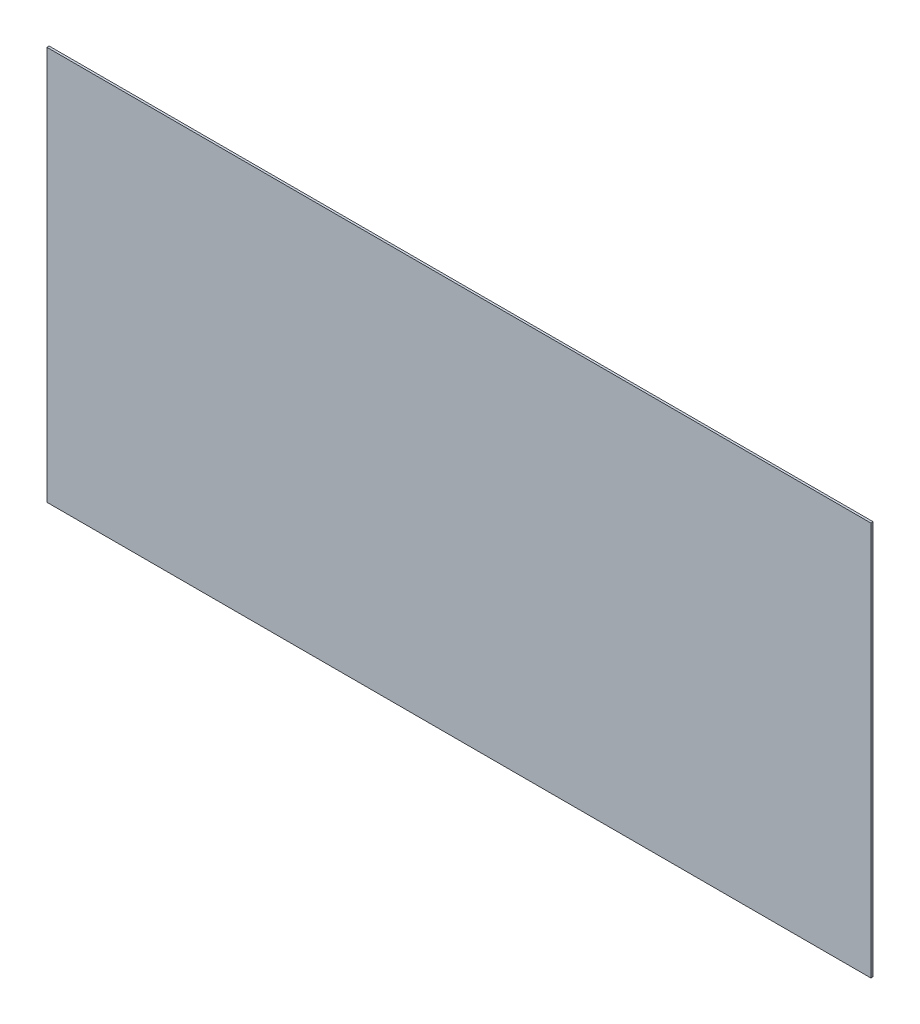
ISO-10303-21;
HEADER;
FILE_DESCRIPTION(('STEP AP214'),'2;1');
FILE_NAME('part.step','',(''),(''),'','','');
FILE_SCHEMA(('AUTOMOTIVE_DESIGN { 1 0 10303 214 1 1 1 1 }'));
ENDSEC;
DATA;
#1=APPLICATION_CONTEXT('core data for automotive mechanical design processes');
#2=APPLICATION_PROTOCOL_DEFINITION('international standard','automotive_design',2000,#1);
#3=PRODUCT_CONTEXT('',#1,'mechanical');
#4=PRODUCT('Part','Part','',(#3));
#5=PRODUCT_RELATED_PRODUCT_CATEGORY('part','',(#4));
#6=PRODUCT_DEFINITION_FORMATION('','',#4);
#7=PRODUCT_DEFINITION_CONTEXT('part definition',#1,'design');
#8=PRODUCT_DEFINITION('design','',#6,#7);
#9=PRODUCT_DEFINITION_SHAPE('','',#8);
#10=(LENGTH_UNIT() NAMED_UNIT(*) SI_UNIT(.MILLI.,.METRE.));
#11=(NAMED_UNIT(*) PLANE_ANGLE_UNIT() SI_UNIT($,.RADIAN.));
#12=(NAMED_UNIT(*) SI_UNIT($,.STERADIAN.) SOLID_ANGLE_UNIT());
#13=UNCERTAINTY_MEASURE_WITH_UNIT(LENGTH_MEASURE(1.E-05),#10,'distance_accuracy_value','');
#14=(GEOMETRIC_REPRESENTATION_CONTEXT(3) GLOBAL_UNCERTAINTY_ASSIGNED_CONTEXT((#13)) GLOBAL_UNIT_ASSIGNED_CONTEXT((#10,
#11,#12)) REPRESENTATION_CONTEXT('',''));
#15=CARTESIAN_POINT('',(0.,0.,0.));
#16=DIRECTION('',(0.,0.,1.));
#17=DIRECTION('',(1.,0.,0.));
#18=AXIS2_PLACEMENT_3D('',#15,#16,#17);
#19=CARTESIAN_POINT('',(0.,0.,1.5875));
#20=DIRECTION('',(1.,0.,0.));
#21=DIRECTION('',(0.,1.,0.));
#22=AXIS2_PLACEMENT_3D('',#19,#20,#21);
#23=PLANE('',#22);
#24=DIRECTION('',(0.,-1.,0.));
#25=VECTOR('',#24,1.);
#26=CARTESIAN_POINT('',(0.,0.,0.));
#27=LINE('',#26,#25);
#28=CARTESIAN_POINT('',(1.11022302462516E-13,279.4,0.));
#29=VERTEX_POINT('',#28);
#30=CARTESIAN_POINT('',(0.,0.,0.));
#31=VERTEX_POINT('',#30);
#32=EDGE_CURVE('E96',#29,#31,#27,.T.);
#33=ORIENTED_EDGE('',*,*,#32,.T.);
#34=DIRECTION('',(0.,0.,-1.));
#35=VECTOR('',#34,1.);
#36=CARTESIAN_POINT('',(0.,0.,1.5875));
#37=LINE('',#36,#35);
#38=CARTESIAN_POINT('',(0.,0.,1.5875));
#39=VERTEX_POINT('',#38);
#40=EDGE_CURVE('E11',#39,#31,#37,.T.);
#41=ORIENTED_EDGE('',*,*,#40,.F.);
#42=DIRECTION('',(0.,-1.,0.));
#43=VECTOR('',#42,1.);
#44=CARTESIAN_POINT('',(0.,0.,1.5875));
#45=LINE('',#44,#43);
#46=CARTESIAN_POINT('',(1.11022302462516E-13,279.4,1.5875));
#47=VERTEX_POINT('',#46);
#48=EDGE_CURVE('E84',#47,#39,#45,.T.);
#49=ORIENTED_EDGE('',*,*,#48,.F.);
#50=DIRECTION('',(0.,0.,-1.));
#51=VECTOR('',#50,1.);
#52=CARTESIAN_POINT('',(1.11022302462516E-13,279.4,1.5875));
#53=LINE('',#52,#51);
#54=EDGE_CURVE('E92',#47,#29,#53,.T.);
#55=ORIENTED_EDGE('',*,*,#54,.T.);
#56=EDGE_LOOP('',(#33,#41,#49,#55));
#57=FACE_BOUND('',#56,.T.);
#58=ADVANCED_FACE('F33',(#57),#23,.F.);
#59=CARTESIAN_POINT('',(0.,0.,1.5875));
#60=DIRECTION('',(0.,1.,0.));
#61=DIRECTION('',(0.,0.,1.));
#62=AXIS2_PLACEMENT_3D('',#59,#60,#61);
#63=PLANE('',#62);
#64=DIRECTION('',(1.,0.,0.));
#65=VECTOR('',#64,1.);
#66=CARTESIAN_POINT('',(0.,0.,0.));
#67=LINE('',#66,#65);
#68=CARTESIAN_POINT('',(584.2,0.,0.));
#69=VERTEX_POINT('',#68);
#70=EDGE_CURVE('E88',#31,#69,#67,.T.);
#71=ORIENTED_EDGE('',*,*,#70,.T.);
#72=DIRECTION('',(0.,0.,-1.));
#73=VECTOR('',#72,1.);
#74=CARTESIAN_POINT('',(584.2,0.,1.5875));
#75=LINE('',#74,#73);
#76=CARTESIAN_POINT('',(584.2,0.,1.5875));
#77=VERTEX_POINT('',#76);
#78=EDGE_CURVE('E41',#77,#69,#75,.T.);
#79=ORIENTED_EDGE('',*,*,#78,.F.);
#80=DIRECTION('',(1.,0.,0.));
#81=VECTOR('',#80,1.);
#82=CARTESIAN_POINT('',(0.,0.,1.5875));
#83=LINE('',#82,#81);
#84=EDGE_CURVE('E79',#39,#77,#83,.T.);
#85=ORIENTED_EDGE('',*,*,#84,.F.);
#86=ORIENTED_EDGE('',*,*,#40,.T.);
#87=EDGE_LOOP('',(#71,#79,#85,#86));
#88=FACE_BOUND('',#87,.T.);
#89=ADVANCED_FACE('F87',(#88),#63,.F.);
#90=CARTESIAN_POINT('',(584.2,0.,1.5875));
#91=DIRECTION('',(-1.,0.,0.));
#92=DIRECTION('',(0.,-1.,0.));
#93=AXIS2_PLACEMENT_3D('',#90,#91,#92);
#94=PLANE('',#93);
#95=DIRECTION('',(0.,1.,0.));
#96=VECTOR('',#95,1.);
#97=CARTESIAN_POINT('',(584.2,0.,0.));
#98=LINE('',#97,#96);
#99=CARTESIAN_POINT('',(584.2,279.4,0.));
#100=VERTEX_POINT('',#99);
#101=EDGE_CURVE('E66',#69,#100,#98,.T.);
#102=ORIENTED_EDGE('',*,*,#101,.T.);
#103=DIRECTION('',(0.,0.,-1.));
#104=VECTOR('',#103,1.);
#105=CARTESIAN_POINT('',(584.2,279.4,1.5875));
#106=LINE('',#105,#104);
#107=CARTESIAN_POINT('',(584.2,279.4,1.5875));
#108=VERTEX_POINT('',#107);
#109=EDGE_CURVE('E89',#108,#100,#106,.T.);
#110=ORIENTED_EDGE('',*,*,#109,.F.);
#111=DIRECTION('',(0.,1.,0.));
#112=VECTOR('',#111,1.);
#113=CARTESIAN_POINT('',(584.2,0.,1.5875));
#114=LINE('',#113,#112);
#115=EDGE_CURVE('E82',#77,#108,#114,.T.);
#116=ORIENTED_EDGE('',*,*,#115,.F.);
#117=ORIENTED_EDGE('',*,*,#78,.T.);
#118=EDGE_LOOP('',(#102,#110,#116,#117));
#119=FACE_BOUND('',#118,.T.);
#120=ADVANCED_FACE('F90',(#119),#94,.F.);
#121=CARTESIAN_POINT('',(1.11022302462516E-13,279.4,1.5875));
#122=DIRECTION('',(0.,-1.,0.));
#123=DIRECTION('',(0.,0.,-1.));
#124=AXIS2_PLACEMENT_3D('',#121,#122,#123);
#125=PLANE('',#124);
#126=DIRECTION('',(-1.,0.,0.));
#127=VECTOR('',#126,1.);
#128=CARTESIAN_POINT('',(1.11022302462516E-13,279.4,0.));
#129=LINE('',#128,#127);
#130=EDGE_CURVE('E72',#100,#29,#129,.T.);
#131=ORIENTED_EDGE('',*,*,#130,.T.);
#132=ORIENTED_EDGE('',*,*,#54,.F.);
#133=DIRECTION('',(-1.,0.,0.));
#134=VECTOR('',#133,1.);
#135=CARTESIAN_POINT('',(1.11022302462516E-13,279.4,1.5875));
#136=LINE('',#135,#134);
#137=EDGE_CURVE('E49',#108,#47,#136,.T.);
#138=ORIENTED_EDGE('',*,*,#137,.F.);
#139=ORIENTED_EDGE('',*,*,#109,.T.);
#140=EDGE_LOOP('',(#131,#132,#138,#139));
#141=FACE_BOUND('',#140,.T.);
#142=ADVANCED_FACE('F103',(#141),#125,.F.);
#143=CARTESIAN_POINT('',(0.,0.,1.5875));
#144=DIRECTION('',(0.,0.,-1.));
#145=DIRECTION('',(-1.,0.,0.));
#146=AXIS2_PLACEMENT_3D('',#143,#144,#145);
#147=PLANE('',#146);
#148=ORIENTED_EDGE('',*,*,#48,.T.);
#149=ORIENTED_EDGE('',*,*,#84,.T.);
#150=ORIENTED_EDGE('',*,*,#115,.T.);
#151=ORIENTED_EDGE('',*,*,#137,.T.);
#152=EDGE_LOOP('',(#148,#149,#150,#151));
#153=FACE_BOUND('',#152,.T.);
#154=ADVANCED_FACE('F80',(#153),#147,.F.);
#155=CARTESIAN_POINT('',(0.,0.,0.));
#156=DIRECTION('',(0.,0.,-1.));
#157=DIRECTION('',(-1.,0.,0.));
#158=AXIS2_PLACEMENT_3D('',#155,#156,#157);
#159=PLANE('',#158);
#160=ORIENTED_EDGE('',*,*,#32,.F.);
#161=ORIENTED_EDGE('',*,*,#130,.F.);
#162=ORIENTED_EDGE('',*,*,#101,.F.);
#163=ORIENTED_EDGE('',*,*,#70,.F.);
#164=EDGE_LOOP('',(#160,#161,#162,#163));
#165=FACE_BOUND('',#164,.T.);
#166=ADVANCED_FACE('F106',(#165),#159,.T.);
#167=CLOSED_SHELL('',(#58,#89,#120,#142,#154,#166));
#168=MANIFOLD_SOLID_BREP('B2',#167);
#169=ADVANCED_BREP_SHAPE_REPRESENTATION('',(#18,#168),#14);
#170=SHAPE_DEFINITION_REPRESENTATION(#9,#169);
ENDSEC;
END-ISO-10303-21;
